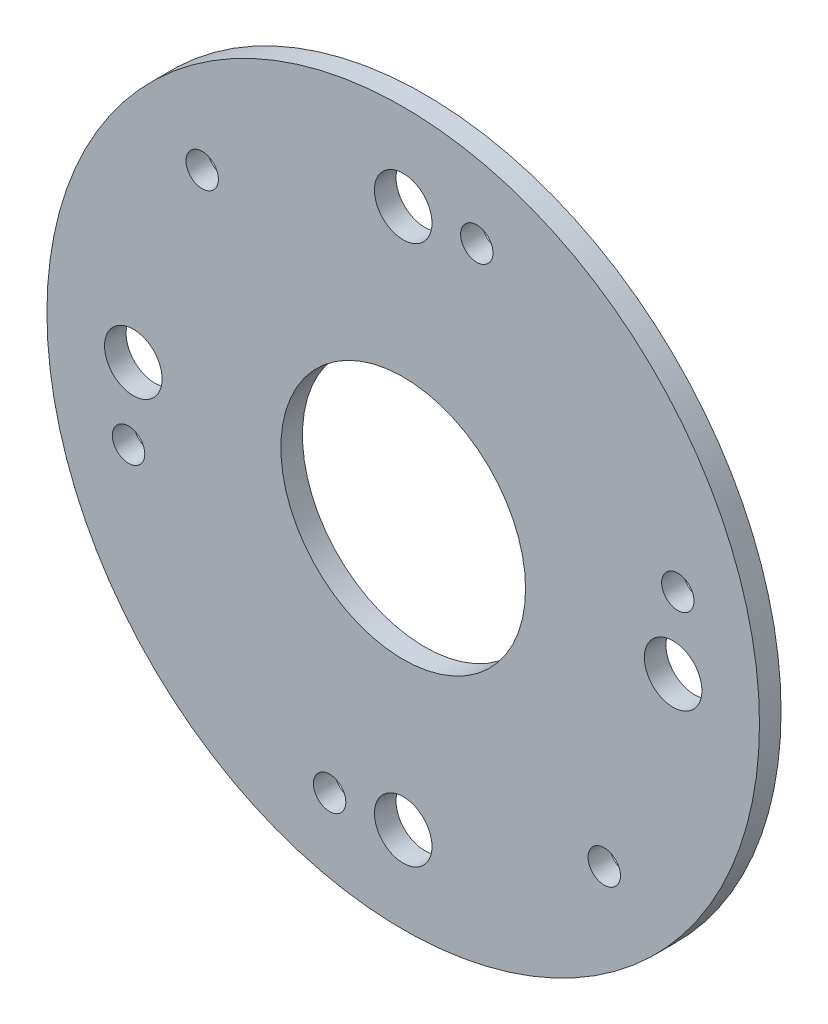
ISO-10303-21;
HEADER;
FILE_DESCRIPTION(('STEP AP214'),'2;1');
FILE_NAME('part.step','',(''),(''),'','','');
FILE_SCHEMA(('AUTOMOTIVE_DESIGN { 1 0 10303 214 1 1 1 1 }'));
ENDSEC;
DATA;
#1=APPLICATION_CONTEXT('core data for automotive mechanical design processes');
#2=APPLICATION_PROTOCOL_DEFINITION('international standard','automotive_design',2000,#1);
#3=PRODUCT_CONTEXT('',#1,'mechanical');
#4=PRODUCT('Part','Part','',(#3));
#5=PRODUCT_RELATED_PRODUCT_CATEGORY('part','',(#4));
#6=PRODUCT_DEFINITION_FORMATION('','',#4);
#7=PRODUCT_DEFINITION_CONTEXT('part definition',#1,'design');
#8=PRODUCT_DEFINITION('design','',#6,#7);
#9=PRODUCT_DEFINITION_SHAPE('','',#8);
#10=(LENGTH_UNIT() NAMED_UNIT(*) SI_UNIT(.MILLI.,.METRE.));
#11=(NAMED_UNIT(*) PLANE_ANGLE_UNIT() SI_UNIT($,.RADIAN.));
#12=(NAMED_UNIT(*) SI_UNIT($,.STERADIAN.) SOLID_ANGLE_UNIT());
#13=UNCERTAINTY_MEASURE_WITH_UNIT(LENGTH_MEASURE(1.E-05),#10,'distance_accuracy_value','');
#14=(GEOMETRIC_REPRESENTATION_CONTEXT(3) GLOBAL_UNCERTAINTY_ASSIGNED_CONTEXT((#13)) GLOBAL_UNIT_ASSIGNED_CONTEXT((#10,
#11,#12)) REPRESENTATION_CONTEXT('',''));
#15=CARTESIAN_POINT('',(0.,0.,0.));
#16=DIRECTION('',(0.,0.,1.));
#17=DIRECTION('',(1.,0.,0.));
#18=AXIS2_PLACEMENT_3D('',#15,#16,#17);
#19=CARTESIAN_POINT('',(0.,0.,58.5));
#20=DIRECTION('',(0.,0.,1.));
#21=DIRECTION('',(1.,0.,0.));
#22=AXIS2_PLACEMENT_3D('',#19,#20,#21);
#23=PLANE('',#22);
#24=CARTESIAN_POINT('',(37.5,0.,58.5));
#25=DIRECTION('',(0.,0.,1.));
#26=DIRECTION('',(1.,0.,0.));
#27=AXIS2_PLACEMENT_3D('',#24,#25,#26);
#28=CIRCLE('',#27,4.);
#29=CARTESIAN_POINT('',(41.5,0.,58.5));
#30=VERTEX_POINT('',#29);
#31=EDGE_CURVE('E64',#30,#30,#28,.T.);
#32=ORIENTED_EDGE('',*,*,#31,.F.);
#33=EDGE_LOOP('',(#32));
#34=FACE_BOUND('',#33,.T.);
#35=CARTESIAN_POINT('',(0.,37.5,58.5));
#36=DIRECTION('',(0.,0.,1.));
#37=DIRECTION('',(1.,0.,0.));
#38=AXIS2_PLACEMENT_3D('',#35,#36,#37);
#39=CIRCLE('',#38,4.);
#40=CARTESIAN_POINT('',(4.,37.5,58.5));
#41=VERTEX_POINT('',#40);
#42=EDGE_CURVE('E101',#41,#41,#39,.T.);
#43=ORIENTED_EDGE('',*,*,#42,.F.);
#44=EDGE_LOOP('',(#43));
#45=FACE_BOUND('',#44,.T.);
#46=CARTESIAN_POINT('',(-37.5,0.,58.5));
#47=DIRECTION('',(0.,0.,1.));
#48=DIRECTION('',(1.,0.,0.));
#49=AXIS2_PLACEMENT_3D('',#46,#47,#48);
#50=CIRCLE('',#49,4.);
#51=CARTESIAN_POINT('',(-33.5,0.,58.5));
#52=VERTEX_POINT('',#51);
#53=EDGE_CURVE('E97',#52,#52,#50,.T.);
#54=ORIENTED_EDGE('',*,*,#53,.F.);
#55=EDGE_LOOP('',(#54));
#56=FACE_BOUND('',#55,.T.);
#57=CARTESIAN_POINT('',(0.,-37.5,58.5));
#58=DIRECTION('',(0.,0.,1.));
#59=DIRECTION('',(1.,0.,0.));
#60=AXIS2_PLACEMENT_3D('',#57,#58,#59);
#61=CIRCLE('',#60,4.);
#62=CARTESIAN_POINT('',(3.99999999999999,-37.5,58.5));
#63=VERTEX_POINT('',#62);
#64=EDGE_CURVE('E93',#63,#63,#61,.T.);
#65=ORIENTED_EDGE('',*,*,#64,.F.);
#66=EDGE_LOOP('',(#65));
#67=FACE_BOUND('',#66,.T.);
#68=CARTESIAN_POINT('',(-10.2233522815496,-38.1540701384182,58.5));
#69=DIRECTION('',(0.,0.,1.));
#70=DIRECTION('',(1.,0.,0.));
#71=AXIS2_PLACEMENT_3D('',#68,#69,#70);
#72=CIRCLE('',#71,2.25);
#73=CARTESIAN_POINT('',(-7.9733522815496,-38.1540701384182,58.5));
#74=VERTEX_POINT('',#73);
#75=EDGE_CURVE('E88',#74,#74,#72,.T.);
#76=ORIENTED_EDGE('',*,*,#75,.F.);
#77=EDGE_LOOP('',(#76));
#78=FACE_BOUND('',#77,.T.);
#79=CARTESIAN_POINT('',(-38.1540701384182,-10.2233522815496,58.5));
#80=DIRECTION('',(0.,0.,1.));
#81=DIRECTION('',(1.,0.,0.));
#82=AXIS2_PLACEMENT_3D('',#79,#80,#81);
#83=CIRCLE('',#82,2.25);
#84=CARTESIAN_POINT('',(-35.9040701384182,-10.2233522815496,58.5));
#85=VERTEX_POINT('',#84);
#86=EDGE_CURVE('E83',#85,#85,#83,.T.);
#87=ORIENTED_EDGE('',*,*,#86,.F.);
#88=EDGE_LOOP('',(#87));
#89=FACE_BOUND('',#88,.T.);
#90=CARTESIAN_POINT('',(-27.9307178568686,27.9307178568686,58.5));
#91=DIRECTION('',(0.,0.,1.));
#92=DIRECTION('',(1.,0.,0.));
#93=AXIS2_PLACEMENT_3D('',#90,#91,#92);
#94=CIRCLE('',#93,2.25);
#95=CARTESIAN_POINT('',(-25.6807178568686,27.9307178568686,58.5));
#96=VERTEX_POINT('',#95);
#97=EDGE_CURVE('E78',#96,#96,#94,.T.);
#98=ORIENTED_EDGE('',*,*,#97,.F.);
#99=EDGE_LOOP('',(#98));
#100=FACE_BOUND('',#99,.T.);
#101=CARTESIAN_POINT('',(10.2233522815496,38.1540701384182,58.5));
#102=DIRECTION('',(0.,0.,1.));
#103=DIRECTION('',(1.,0.,0.));
#104=AXIS2_PLACEMENT_3D('',#101,#102,#103);
#105=CIRCLE('',#104,2.25);
#106=CARTESIAN_POINT('',(12.4733522815496,38.1540701384182,58.5));
#107=VERTEX_POINT('',#106);
#108=EDGE_CURVE('E73',#107,#107,#105,.T.);
#109=ORIENTED_EDGE('',*,*,#108,.F.);
#110=EDGE_LOOP('',(#109));
#111=FACE_BOUND('',#110,.T.);
#112=CARTESIAN_POINT('',(38.1540701384182,10.2233522815496,58.5));
#113=DIRECTION('',(0.,0.,1.));
#114=DIRECTION('',(1.,0.,0.));
#115=AXIS2_PLACEMENT_3D('',#112,#113,#114);
#116=CIRCLE('',#115,2.25);
#117=CARTESIAN_POINT('',(40.4040701384182,10.2233522815496,58.5));
#118=VERTEX_POINT('',#117);
#119=EDGE_CURVE('E69',#118,#118,#116,.T.);
#120=ORIENTED_EDGE('',*,*,#119,.F.);
#121=EDGE_LOOP('',(#120));
#122=FACE_BOUND('',#121,.T.);
#123=CARTESIAN_POINT('',(27.9307178568686,-27.9307178568686,58.5));
#124=DIRECTION('',(0.,0.,1.));
#125=DIRECTION('',(1.,0.,0.));
#126=AXIS2_PLACEMENT_3D('',#123,#124,#125);
#127=CIRCLE('',#126,2.25);
#128=CARTESIAN_POINT('',(30.1807178568686,-27.9307178568686,58.5));
#129=VERTEX_POINT('',#128);
#130=EDGE_CURVE('E63',#129,#129,#127,.T.);
#131=ORIENTED_EDGE('',*,*,#130,.F.);
#132=EDGE_LOOP('',(#131));
#133=FACE_BOUND('',#132,.T.);
#134=CARTESIAN_POINT('',(0.,0.,58.5));
#135=DIRECTION('',(0.,0.,1.));
#136=DIRECTION('',(1.,0.,0.));
#137=AXIS2_PLACEMENT_3D('',#134,#135,#136);
#138=CIRCLE('',#137,49.5);
#139=CARTESIAN_POINT('',(49.5,0.,58.5));
#140=VERTEX_POINT('',#139);
#141=EDGE_CURVE('E10',#140,#140,#138,.T.);
#142=ORIENTED_EDGE('',*,*,#141,.T.);
#143=EDGE_LOOP('',(#142));
#144=FACE_BOUND('',#143,.T.);
#145=CARTESIAN_POINT('',(0.,0.,58.5));
#146=DIRECTION('',(0.,0.,1.));
#147=DIRECTION('',(1.,0.,0.));
#148=AXIS2_PLACEMENT_3D('',#145,#146,#147);
#149=CIRCLE('',#148,17.);
#150=CARTESIAN_POINT('',(17.,0.,58.5));
#151=VERTEX_POINT('',#150);
#152=EDGE_CURVE('E53',#151,#151,#149,.T.);
#153=ORIENTED_EDGE('',*,*,#152,.F.);
#154=EDGE_LOOP('',(#153));
#155=FACE_BOUND('',#154,.T.);
#156=ADVANCED_FACE('F36',(#34,#45,#56,#67,#78,#89,#100,#111,#122,#133,#144,#155),#23,.T.);
#157=CARTESIAN_POINT('',(0.,0.,55.5));
#158=DIRECTION('',(0.,0.,1.));
#159=DIRECTION('',(1.,0.,0.));
#160=AXIS2_PLACEMENT_3D('',#157,#158,#159);
#161=PLANE('',#160);
#162=CARTESIAN_POINT('',(37.5,0.,55.5));
#163=DIRECTION('',(0.,0.,1.));
#164=DIRECTION('',(1.,0.,0.));
#165=AXIS2_PLACEMENT_3D('',#162,#163,#164);
#166=CIRCLE('',#165,4.);
#167=CARTESIAN_POINT('',(41.5,0.,55.5));
#168=VERTEX_POINT('',#167);
#169=EDGE_CURVE('E40',#168,#168,#166,.T.);
#170=ORIENTED_EDGE('',*,*,#169,.T.);
#171=EDGE_LOOP('',(#170));
#172=FACE_BOUND('',#171,.T.);
#173=CARTESIAN_POINT('',(0.,37.5,55.5));
#174=DIRECTION('',(0.,0.,1.));
#175=DIRECTION('',(1.,0.,0.));
#176=AXIS2_PLACEMENT_3D('',#173,#174,#175);
#177=CIRCLE('',#176,4.);
#178=CARTESIAN_POINT('',(4.,37.5,55.5));
#179=VERTEX_POINT('',#178);
#180=EDGE_CURVE('E98',#179,#179,#177,.T.);
#181=ORIENTED_EDGE('',*,*,#180,.T.);
#182=EDGE_LOOP('',(#181));
#183=FACE_BOUND('',#182,.T.);
#184=CARTESIAN_POINT('',(-37.5,0.,55.5));
#185=DIRECTION('',(0.,0.,1.));
#186=DIRECTION('',(1.,0.,0.));
#187=AXIS2_PLACEMENT_3D('',#184,#185,#186);
#188=CIRCLE('',#187,4.);
#189=CARTESIAN_POINT('',(-33.5,0.,55.5));
#190=VERTEX_POINT('',#189);
#191=EDGE_CURVE('E94',#190,#190,#188,.T.);
#192=ORIENTED_EDGE('',*,*,#191,.T.);
#193=EDGE_LOOP('',(#192));
#194=FACE_BOUND('',#193,.T.);
#195=CARTESIAN_POINT('',(0.,-37.5,55.5));
#196=DIRECTION('',(0.,0.,1.));
#197=DIRECTION('',(1.,0.,0.));
#198=AXIS2_PLACEMENT_3D('',#195,#196,#197);
#199=CIRCLE('',#198,4.);
#200=CARTESIAN_POINT('',(3.99999999999999,-37.5,55.5));
#201=VERTEX_POINT('',#200);
#202=EDGE_CURVE('E89',#201,#201,#199,.T.);
#203=ORIENTED_EDGE('',*,*,#202,.T.);
#204=EDGE_LOOP('',(#203));
#205=FACE_BOUND('',#204,.T.);
#206=CARTESIAN_POINT('',(-10.2233522815496,-38.1540701384182,55.5));
#207=DIRECTION('',(0.,0.,1.));
#208=DIRECTION('',(1.,0.,0.));
#209=AXIS2_PLACEMENT_3D('',#206,#207,#208);
#210=CIRCLE('',#209,2.25);
#211=CARTESIAN_POINT('',(-7.9733522815496,-38.1540701384182,55.5));
#212=VERTEX_POINT('',#211);
#213=EDGE_CURVE('E84',#212,#212,#210,.T.);
#214=ORIENTED_EDGE('',*,*,#213,.T.);
#215=EDGE_LOOP('',(#214));
#216=FACE_BOUND('',#215,.T.);
#217=CARTESIAN_POINT('',(-38.1540701384182,-10.2233522815496,55.5));
#218=DIRECTION('',(0.,0.,1.));
#219=DIRECTION('',(1.,0.,0.));
#220=AXIS2_PLACEMENT_3D('',#217,#218,#219);
#221=CIRCLE('',#220,2.25);
#222=CARTESIAN_POINT('',(-35.9040701384182,-10.2233522815496,55.5));
#223=VERTEX_POINT('',#222);
#224=EDGE_CURVE('E79',#223,#223,#221,.T.);
#225=ORIENTED_EDGE('',*,*,#224,.T.);
#226=EDGE_LOOP('',(#225));
#227=FACE_BOUND('',#226,.T.);
#228=CARTESIAN_POINT('',(-27.9307178568686,27.9307178568686,55.5));
#229=DIRECTION('',(0.,0.,1.));
#230=DIRECTION('',(1.,0.,0.));
#231=AXIS2_PLACEMENT_3D('',#228,#229,#230);
#232=CIRCLE('',#231,2.25);
#233=CARTESIAN_POINT('',(-25.6807178568686,27.9307178568686,55.5));
#234=VERTEX_POINT('',#233);
#235=EDGE_CURVE('E74',#234,#234,#232,.T.);
#236=ORIENTED_EDGE('',*,*,#235,.T.);
#237=EDGE_LOOP('',(#236));
#238=FACE_BOUND('',#237,.T.);
#239=CARTESIAN_POINT('',(10.2233522815496,38.1540701384182,55.5));
#240=DIRECTION('',(0.,0.,1.));
#241=DIRECTION('',(1.,0.,0.));
#242=AXIS2_PLACEMENT_3D('',#239,#240,#241);
#243=CIRCLE('',#242,2.25);
#244=CARTESIAN_POINT('',(12.4733522815496,38.1540701384182,55.5));
#245=VERTEX_POINT('',#244);
#246=EDGE_CURVE('E70',#245,#245,#243,.T.);
#247=ORIENTED_EDGE('',*,*,#246,.T.);
#248=EDGE_LOOP('',(#247));
#249=FACE_BOUND('',#248,.T.);
#250=CARTESIAN_POINT('',(38.1540701384182,10.2233522815496,55.5));
#251=DIRECTION('',(0.,0.,1.));
#252=DIRECTION('',(1.,0.,0.));
#253=AXIS2_PLACEMENT_3D('',#250,#251,#252);
#254=CIRCLE('',#253,2.25);
#255=CARTESIAN_POINT('',(40.4040701384182,10.2233522815496,55.5));
#256=VERTEX_POINT('',#255);
#257=EDGE_CURVE('E65',#256,#256,#254,.T.);
#258=ORIENTED_EDGE('',*,*,#257,.T.);
#259=EDGE_LOOP('',(#258));
#260=FACE_BOUND('',#259,.T.);
#261=CARTESIAN_POINT('',(27.9307178568686,-27.9307178568686,55.5));
#262=DIRECTION('',(0.,0.,1.));
#263=DIRECTION('',(1.,0.,0.));
#264=AXIS2_PLACEMENT_3D('',#261,#262,#263);
#265=CIRCLE('',#264,2.25);
#266=CARTESIAN_POINT('',(30.1807178568686,-27.9307178568686,55.5));
#267=VERTEX_POINT('',#266);
#268=EDGE_CURVE('E59',#267,#267,#265,.T.);
#269=ORIENTED_EDGE('',*,*,#268,.T.);
#270=EDGE_LOOP('',(#269));
#271=FACE_BOUND('',#270,.T.);
#272=CARTESIAN_POINT('',(0.,0.,55.5));
#273=DIRECTION('',(0.,0.,1.));
#274=DIRECTION('',(1.,0.,0.));
#275=AXIS2_PLACEMENT_3D('',#272,#273,#274);
#276=CIRCLE('',#275,49.5);
#277=CARTESIAN_POINT('',(49.5,0.,55.5));
#278=VERTEX_POINT('',#277);
#279=EDGE_CURVE('E45',#278,#278,#276,.T.);
#280=ORIENTED_EDGE('',*,*,#279,.F.);
#281=EDGE_LOOP('',(#280));
#282=FACE_BOUND('',#281,.T.);
#283=CARTESIAN_POINT('',(0.,0.,55.5));
#284=DIRECTION('',(0.,0.,1.));
#285=DIRECTION('',(1.,0.,0.));
#286=AXIS2_PLACEMENT_3D('',#283,#284,#285);
#287=CIRCLE('',#286,17.);
#288=CARTESIAN_POINT('',(17.,0.,55.5));
#289=VERTEX_POINT('',#288);
#290=EDGE_CURVE('E56',#289,#289,#287,.T.);
#291=ORIENTED_EDGE('',*,*,#290,.T.);
#292=EDGE_LOOP('',(#291));
#293=FACE_BOUND('',#292,.T.);
#294=ADVANCED_FACE('F141',(#172,#183,#194,#205,#216,#227,#238,#249,#260,#271,#282,#293),#161,.F.);
#295=CARTESIAN_POINT('',(0.,0.,58.5));
#296=DIRECTION('',(0.,0.,-1.));
#297=DIRECTION('',(-1.,0.,0.));
#298=AXIS2_PLACEMENT_3D('',#295,#296,#297);
#299=CYLINDRICAL_SURFACE('',#298,49.5);
#300=ORIENTED_EDGE('',*,*,#141,.F.);
#301=EDGE_LOOP('',(#300));
#302=FACE_BOUND('',#301,.T.);
#303=ORIENTED_EDGE('',*,*,#279,.T.);
#304=EDGE_LOOP('',(#303));
#305=FACE_BOUND('',#304,.T.);
#306=ADVANCED_FACE('F38',(#302,#305),#299,.T.);
#307=CARTESIAN_POINT('',(0.,0.,58.5));
#308=DIRECTION('',(0.,0.,-1.));
#309=DIRECTION('',(-1.,0.,0.));
#310=AXIS2_PLACEMENT_3D('',#307,#308,#309);
#311=CYLINDRICAL_SURFACE('',#310,17.);
#312=ORIENTED_EDGE('',*,*,#152,.T.);
#313=EDGE_LOOP('',(#312));
#314=FACE_BOUND('',#313,.T.);
#315=ORIENTED_EDGE('',*,*,#290,.F.);
#316=EDGE_LOOP('',(#315));
#317=FACE_BOUND('',#316,.T.);
#318=ADVANCED_FACE('F143',(#314,#317),#311,.F.);
#319=CARTESIAN_POINT('',(27.9307178568686,-27.9307178568686,-100.));
#320=DIRECTION('',(0.,0.,1.));
#321=DIRECTION('',(1.,0.,0.));
#322=AXIS2_PLACEMENT_3D('',#319,#320,#321);
#323=CYLINDRICAL_SURFACE('',#322,2.25);
#324=ORIENTED_EDGE('',*,*,#130,.T.);
#325=EDGE_LOOP('',(#324));
#326=FACE_BOUND('',#325,.T.);
#327=ORIENTED_EDGE('',*,*,#268,.F.);
#328=EDGE_LOOP('',(#327));
#329=FACE_BOUND('',#328,.T.);
#330=ADVANCED_FACE('F145',(#326,#329),#323,.F.);
#331=CARTESIAN_POINT('',(38.1540701384182,10.2233522815496,-100.));
#332=DIRECTION('',(0.,0.,1.));
#333=DIRECTION('',(1.,0.,0.));
#334=AXIS2_PLACEMENT_3D('',#331,#332,#333);
#335=CYLINDRICAL_SURFACE('',#334,2.25);
#336=ORIENTED_EDGE('',*,*,#119,.T.);
#337=EDGE_LOOP('',(#336));
#338=FACE_BOUND('',#337,.T.);
#339=ORIENTED_EDGE('',*,*,#257,.F.);
#340=EDGE_LOOP('',(#339));
#341=FACE_BOUND('',#340,.T.);
#342=ADVANCED_FACE('F151',(#338,#341),#335,.F.);
#343=CARTESIAN_POINT('',(10.2233522815496,38.1540701384182,-100.));
#344=DIRECTION('',(0.,0.,1.));
#345=DIRECTION('',(1.,0.,0.));
#346=AXIS2_PLACEMENT_3D('',#343,#344,#345);
#347=CYLINDRICAL_SURFACE('',#346,2.25);
#348=ORIENTED_EDGE('',*,*,#108,.T.);
#349=EDGE_LOOP('',(#348));
#350=FACE_BOUND('',#349,.T.);
#351=ORIENTED_EDGE('',*,*,#246,.F.);
#352=EDGE_LOOP('',(#351));
#353=FACE_BOUND('',#352,.T.);
#354=ADVANCED_FACE('F192',(#350,#353),#347,.F.);
#355=CARTESIAN_POINT('',(-27.9307178568686,27.9307178568686,-100.));
#356=DIRECTION('',(0.,0.,1.));
#357=DIRECTION('',(1.,0.,0.));
#358=AXIS2_PLACEMENT_3D('',#355,#356,#357);
#359=CYLINDRICAL_SURFACE('',#358,2.25);
#360=ORIENTED_EDGE('',*,*,#97,.T.);
#361=EDGE_LOOP('',(#360));
#362=FACE_BOUND('',#361,.T.);
#363=ORIENTED_EDGE('',*,*,#235,.F.);
#364=EDGE_LOOP('',(#363));
#365=FACE_BOUND('',#364,.T.);
#366=ADVANCED_FACE('F198',(#362,#365),#359,.F.);
#367=CARTESIAN_POINT('',(-38.1540701384182,-10.2233522815496,-100.));
#368=DIRECTION('',(0.,0.,1.));
#369=DIRECTION('',(1.,0.,0.));
#370=AXIS2_PLACEMENT_3D('',#367,#368,#369);
#371=CYLINDRICAL_SURFACE('',#370,2.25);
#372=ORIENTED_EDGE('',*,*,#86,.T.);
#373=EDGE_LOOP('',(#372));
#374=FACE_BOUND('',#373,.T.);
#375=ORIENTED_EDGE('',*,*,#224,.F.);
#376=EDGE_LOOP('',(#375));
#377=FACE_BOUND('',#376,.T.);
#378=ADVANCED_FACE('F206',(#374,#377),#371,.F.);
#379=CARTESIAN_POINT('',(-10.2233522815496,-38.1540701384182,-100.));
#380=DIRECTION('',(0.,0.,1.));
#381=DIRECTION('',(1.,0.,0.));
#382=AXIS2_PLACEMENT_3D('',#379,#380,#381);
#383=CYLINDRICAL_SURFACE('',#382,2.25);
#384=ORIENTED_EDGE('',*,*,#75,.T.);
#385=EDGE_LOOP('',(#384));
#386=FACE_BOUND('',#385,.T.);
#387=ORIENTED_EDGE('',*,*,#213,.F.);
#388=EDGE_LOOP('',(#387));
#389=FACE_BOUND('',#388,.T.);
#390=ADVANCED_FACE('F202',(#386,#389),#383,.F.);
#391=CARTESIAN_POINT('',(0.,-37.5,-100.));
#392=DIRECTION('',(0.,0.,1.));
#393=DIRECTION('',(1.,0.,0.));
#394=AXIS2_PLACEMENT_3D('',#391,#392,#393);
#395=CYLINDRICAL_SURFACE('',#394,4.);
#396=ORIENTED_EDGE('',*,*,#64,.T.);
#397=EDGE_LOOP('',(#396));
#398=FACE_BOUND('',#397,.T.);
#399=ORIENTED_EDGE('',*,*,#202,.F.);
#400=EDGE_LOOP('',(#399));
#401=FACE_BOUND('',#400,.T.);
#402=ADVANCED_FACE('F205',(#398,#401),#395,.F.);
#403=CARTESIAN_POINT('',(-37.5,0.,-100.));
#404=DIRECTION('',(0.,0.,1.));
#405=DIRECTION('',(1.,0.,0.));
#406=AXIS2_PLACEMENT_3D('',#403,#404,#405);
#407=CYLINDRICAL_SURFACE('',#406,4.);
#408=ORIENTED_EDGE('',*,*,#53,.T.);
#409=EDGE_LOOP('',(#408));
#410=FACE_BOUND('',#409,.T.);
#411=ORIENTED_EDGE('',*,*,#191,.F.);
#412=EDGE_LOOP('',(#411));
#413=FACE_BOUND('',#412,.T.);
#414=ADVANCED_FACE('F216',(#410,#413),#407,.F.);
#415=CARTESIAN_POINT('',(0.,37.5,-100.));
#416=DIRECTION('',(0.,0.,1.));
#417=DIRECTION('',(1.,0.,0.));
#418=AXIS2_PLACEMENT_3D('',#415,#416,#417);
#419=CYLINDRICAL_SURFACE('',#418,4.);
#420=ORIENTED_EDGE('',*,*,#42,.T.);
#421=EDGE_LOOP('',(#420));
#422=FACE_BOUND('',#421,.T.);
#423=ORIENTED_EDGE('',*,*,#180,.F.);
#424=EDGE_LOOP('',(#423));
#425=FACE_BOUND('',#424,.T.);
#426=ADVANCED_FACE('F220',(#422,#425),#419,.F.);
#427=CARTESIAN_POINT('',(37.5,0.,-100.));
#428=DIRECTION('',(0.,0.,1.));
#429=DIRECTION('',(1.,0.,0.));
#430=AXIS2_PLACEMENT_3D('',#427,#428,#429);
#431=CYLINDRICAL_SURFACE('',#430,4.);
#432=ORIENTED_EDGE('',*,*,#31,.T.);
#433=EDGE_LOOP('',(#432));
#434=FACE_BOUND('',#433,.T.);
#435=ORIENTED_EDGE('',*,*,#169,.F.);
#436=EDGE_LOOP('',(#435));
#437=FACE_BOUND('',#436,.T.);
#438=ADVANCED_FACE('F223',(#434,#437),#431,.F.);
#439=CLOSED_SHELL('',(#156,#294,#306,#318,#330,#342,#354,#366,#378,#390,#402,#414,#426,#438));
#440=MANIFOLD_SOLID_BREP('B2',#439);
#441=ADVANCED_BREP_SHAPE_REPRESENTATION('',(#18,#440),#14);
#442=SHAPE_DEFINITION_REPRESENTATION(#9,#441);
ENDSEC;
END-ISO-10303-21;
